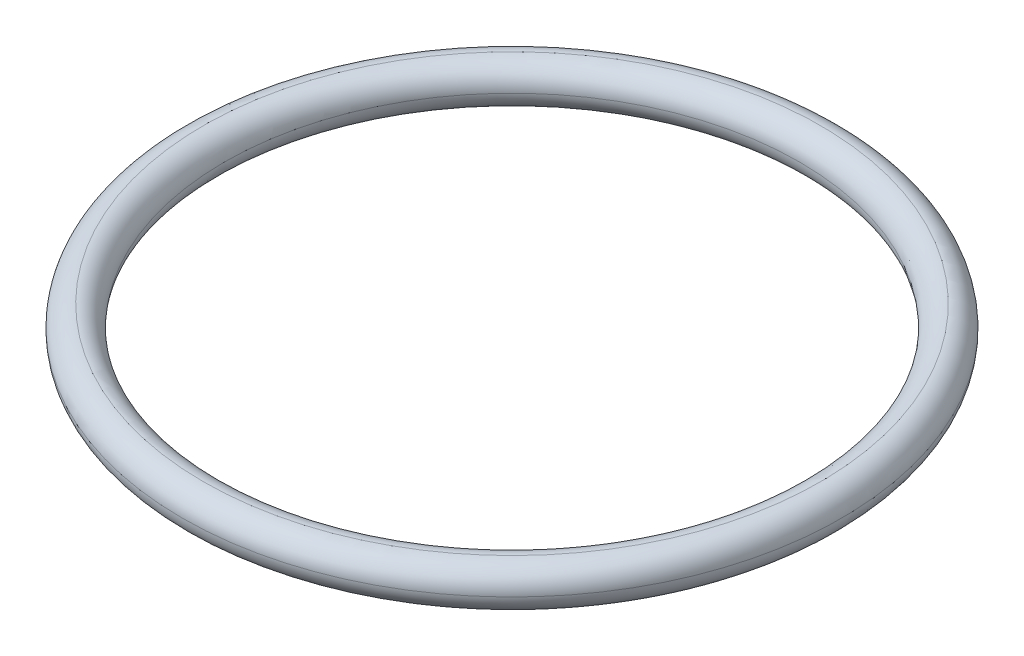
ISO-10303-21;
HEADER;
FILE_DESCRIPTION(('STEP AP214'),'2;1');
FILE_NAME('part.step','',(''),(''),'','','');
FILE_SCHEMA(('AUTOMOTIVE_DESIGN { 1 0 10303 214 1 1 1 1 }'));
ENDSEC;
DATA;
#1=APPLICATION_CONTEXT('core data for automotive mechanical design processes');
#2=APPLICATION_PROTOCOL_DEFINITION('international standard','automotive_design',2000,#1);
#3=PRODUCT_CONTEXT('',#1,'mechanical');
#4=PRODUCT('Part','Part','',(#3));
#5=PRODUCT_RELATED_PRODUCT_CATEGORY('part','',(#4));
#6=PRODUCT_DEFINITION_FORMATION('','',#4);
#7=PRODUCT_DEFINITION_CONTEXT('part definition',#1,'design');
#8=PRODUCT_DEFINITION('design','',#6,#7);
#9=PRODUCT_DEFINITION_SHAPE('','',#8);
#10=(LENGTH_UNIT() NAMED_UNIT(*) SI_UNIT(.MILLI.,.METRE.));
#11=(NAMED_UNIT(*) PLANE_ANGLE_UNIT() SI_UNIT($,.RADIAN.));
#12=(NAMED_UNIT(*) SI_UNIT($,.STERADIAN.) SOLID_ANGLE_UNIT());
#13=UNCERTAINTY_MEASURE_WITH_UNIT(LENGTH_MEASURE(1.E-05),#10,'distance_accuracy_value','');
#14=(GEOMETRIC_REPRESENTATION_CONTEXT(3) GLOBAL_UNCERTAINTY_ASSIGNED_CONTEXT((#13)) GLOBAL_UNIT_ASSIGNED_CONTEXT((#10,
#11,#12)) REPRESENTATION_CONTEXT('',''));
#15=CARTESIAN_POINT('',(0.,0.,0.));
#16=DIRECTION('',(0.,0.,1.));
#17=DIRECTION('',(1.,0.,0.));
#18=AXIS2_PLACEMENT_3D('',#15,#16,#17);
#19=CARTESIAN_POINT('',(0.,1.5,0.));
#20=DIRECTION('',(0.,1.,0.));
#21=DIRECTION('',(0.,0.,1.));
#22=AXIS2_PLACEMENT_3D('',#19,#20,#21);
#23=TOROIDAL_SURFACE('',#22,22.,1.5);
#24=CARTESIAN_POINT('',(0.,1.5,0.));
#25=DIRECTION('',(0.,1.,0.));
#26=DIRECTION('',(0.,0.,1.));
#27=AXIS2_PLACEMENT_3D('',#24,#25,#26);
#28=CIRCLE('',#27,23.5);
#29=CARTESIAN_POINT('',(0.,1.5,23.5));
#30=VERTEX_POINT('',#29);
#31=EDGE_CURVE('E39',#30,#30,#28,.F.);
#32=ORIENTED_EDGE('',*,*,#31,.F.);
#33=EDGE_LOOP('',(#32));
#34=FACE_BOUND('',#33,.T.);
#35=CARTESIAN_POINT('',(0.,3.,0.));
#36=DIRECTION('',(0.,1.,0.));
#37=DIRECTION('',(0.,0.,1.));
#38=AXIS2_PLACEMENT_3D('',#35,#36,#37);
#39=CIRCLE('',#38,22.);
#40=CARTESIAN_POINT('',(0.,3.,22.));
#41=VERTEX_POINT('',#40);
#42=EDGE_CURVE('E10',#41,#41,#39,.T.);
#43=ORIENTED_EDGE('',*,*,#42,.F.);
#44=EDGE_LOOP('',(#43));
#45=FACE_BOUND('',#44,.T.);
#46=ADVANCED_FACE('F33',(#34,#45),#23,.T.);
#47=CARTESIAN_POINT('',(0.,1.5,0.));
#48=DIRECTION('',(0.,1.,0.));
#49=DIRECTION('',(0.,0.,1.));
#50=AXIS2_PLACEMENT_3D('',#47,#48,#49);
#51=TOROIDAL_SURFACE('',#50,22.,1.5);
#52=ORIENTED_EDGE('',*,*,#42,.T.);
#53=EDGE_LOOP('',(#52));
#54=FACE_BOUND('',#53,.T.);
#55=CARTESIAN_POINT('',(0.,1.5,0.));
#56=DIRECTION('',(0.,1.,0.));
#57=DIRECTION('',(0.,0.,1.));
#58=AXIS2_PLACEMENT_3D('',#55,#56,#57);
#59=CIRCLE('',#58,20.5);
#60=CARTESIAN_POINT('',(0.,1.5,20.5));
#61=VERTEX_POINT('',#60);
#62=EDGE_CURVE('E43',#61,#61,#59,.T.);
#63=ORIENTED_EDGE('',*,*,#62,.F.);
#64=EDGE_LOOP('',(#63));
#65=FACE_BOUND('',#64,.T.);
#66=ADVANCED_FACE('F57',(#54,#65),#51,.T.);
#67=CARTESIAN_POINT('',(0.,1.5,0.));
#68=DIRECTION('',(0.,1.,0.));
#69=DIRECTION('',(0.,0.,1.));
#70=AXIS2_PLACEMENT_3D('',#67,#68,#69);
#71=TOROIDAL_SURFACE('',#70,22.,1.5);
#72=ORIENTED_EDGE('',*,*,#31,.T.);
#73=EDGE_LOOP('',(#72));
#74=FACE_BOUND('',#73,.T.);
#75=CARTESIAN_POINT('',(0.,0.,0.));
#76=DIRECTION('',(0.,1.,0.));
#77=DIRECTION('',(0.,0.,1.));
#78=AXIS2_PLACEMENT_3D('',#75,#76,#77);
#79=CIRCLE('',#78,22.);
#80=CARTESIAN_POINT('',(0.,0.,22.));
#81=VERTEX_POINT('',#80);
#82=EDGE_CURVE('E47',#81,#81,#79,.F.);
#83=ORIENTED_EDGE('',*,*,#82,.F.);
#84=EDGE_LOOP('',(#83));
#85=FACE_BOUND('',#84,.T.);
#86=ADVANCED_FACE('F55',(#74,#85),#71,.T.);
#87=CARTESIAN_POINT('',(0.,1.5,0.));
#88=DIRECTION('',(0.,1.,0.));
#89=DIRECTION('',(0.,0.,1.));
#90=AXIS2_PLACEMENT_3D('',#87,#88,#89);
#91=TOROIDAL_SURFACE('',#90,22.,1.5);
#92=ORIENTED_EDGE('',*,*,#62,.T.);
#93=EDGE_LOOP('',(#92));
#94=FACE_BOUND('',#93,.T.);
#95=ORIENTED_EDGE('',*,*,#82,.T.);
#96=EDGE_LOOP('',(#95));
#97=FACE_BOUND('',#96,.T.);
#98=ADVANCED_FACE('F53',(#94,#97),#91,.T.);
#99=CLOSED_SHELL('',(#46,#66,#86,#98));
#100=MANIFOLD_SOLID_BREP('B2',#99);
#101=ADVANCED_BREP_SHAPE_REPRESENTATION('',(#18,#100),#14);
#102=SHAPE_DEFINITION_REPRESENTATION(#9,#101);
ENDSEC;
END-ISO-10303-21;
